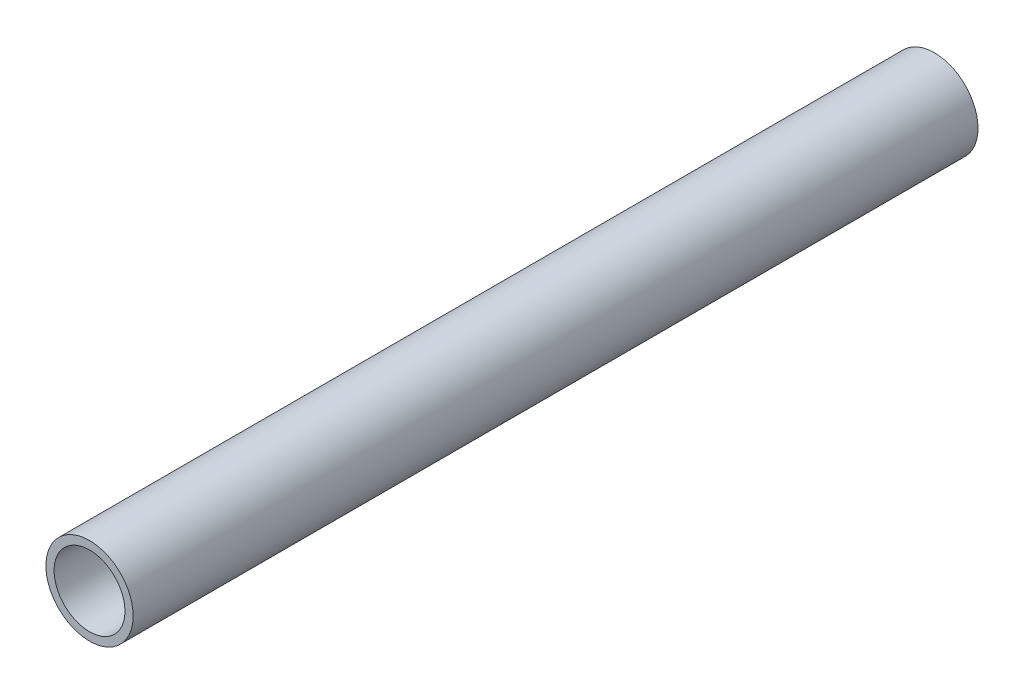
ISO-10303-21;
HEADER;
FILE_DESCRIPTION(('STEP AP214'),'2;1');
FILE_NAME('part.step','',(''),(''),'','','');
FILE_SCHEMA(('AUTOMOTIVE_DESIGN { 1 0 10303 214 1 1 1 1 }'));
ENDSEC;
DATA;
#1=APPLICATION_CONTEXT('core data for automotive mechanical design processes');
#2=APPLICATION_PROTOCOL_DEFINITION('international standard','automotive_design',2000,#1);
#3=PRODUCT_CONTEXT('',#1,'mechanical');
#4=PRODUCT('Part','Part','',(#3));
#5=PRODUCT_RELATED_PRODUCT_CATEGORY('part','',(#4));
#6=PRODUCT_DEFINITION_FORMATION('','',#4);
#7=PRODUCT_DEFINITION_CONTEXT('part definition',#1,'design');
#8=PRODUCT_DEFINITION('design','',#6,#7);
#9=PRODUCT_DEFINITION_SHAPE('','',#8);
#10=(LENGTH_UNIT() NAMED_UNIT(*) SI_UNIT(.MILLI.,.METRE.));
#11=(NAMED_UNIT(*) PLANE_ANGLE_UNIT() SI_UNIT($,.RADIAN.));
#12=(NAMED_UNIT(*) SI_UNIT($,.STERADIAN.) SOLID_ANGLE_UNIT());
#13=UNCERTAINTY_MEASURE_WITH_UNIT(LENGTH_MEASURE(1.E-05),#10,'distance_accuracy_value','');
#14=(GEOMETRIC_REPRESENTATION_CONTEXT(3) GLOBAL_UNCERTAINTY_ASSIGNED_CONTEXT((#13)) GLOBAL_UNIT_ASSIGNED_CONTEXT((#10,
#11,#12)) REPRESENTATION_CONTEXT('',''));
#15=CARTESIAN_POINT('',(0.,0.,0.));
#16=DIRECTION('',(0.,0.,1.));
#17=DIRECTION('',(1.,0.,0.));
#18=AXIS2_PLACEMENT_3D('',#15,#16,#17);
#19=CARTESIAN_POINT('',(0.,0.,155.));
#20=DIRECTION('',(0.,0.,1.));
#21=DIRECTION('',(1.,0.,0.));
#22=AXIS2_PLACEMENT_3D('',#19,#20,#21);
#23=PLANE('',#22);
#24=CARTESIAN_POINT('',(0.,0.,155.));
#25=DIRECTION('',(0.,0.,1.));
#26=DIRECTION('',(1.,0.,0.));
#27=AXIS2_PLACEMENT_3D('',#24,#25,#26);
#28=CIRCLE('',#27,8.);
#29=CARTESIAN_POINT('',(8.,0.,155.));
#30=VERTEX_POINT('',#29);
#31=EDGE_CURVE('E10',#30,#30,#28,.T.);
#32=ORIENTED_EDGE('',*,*,#31,.T.);
#33=EDGE_LOOP('',(#32));
#34=FACE_BOUND('',#33,.T.);
#35=CARTESIAN_POINT('',(0.,0.,155.));
#36=DIRECTION('',(0.,0.,1.));
#37=DIRECTION('',(1.,0.,0.));
#38=AXIS2_PLACEMENT_3D('',#35,#36,#37);
#39=CIRCLE('',#38,6.5);
#40=CARTESIAN_POINT('',(6.5,0.,155.));
#41=VERTEX_POINT('',#40);
#42=EDGE_CURVE('E45',#41,#41,#39,.T.);
#43=ORIENTED_EDGE('',*,*,#42,.F.);
#44=EDGE_LOOP('',(#43));
#45=FACE_BOUND('',#44,.T.);
#46=ADVANCED_FACE('F34',(#34,#45),#23,.T.);
#47=CARTESIAN_POINT('',(0.,0.,0.));
#48=DIRECTION('',(0.,0.,1.));
#49=DIRECTION('',(1.,0.,0.));
#50=AXIS2_PLACEMENT_3D('',#47,#48,#49);
#51=PLANE('',#50);
#52=CARTESIAN_POINT('',(0.,0.,0.));
#53=DIRECTION('',(0.,0.,1.));
#54=DIRECTION('',(1.,0.,0.));
#55=AXIS2_PLACEMENT_3D('',#52,#53,#54);
#56=CIRCLE('',#55,8.);
#57=CARTESIAN_POINT('',(8.,0.,0.));
#58=VERTEX_POINT('',#57);
#59=EDGE_CURVE('E38',#58,#58,#56,.T.);
#60=ORIENTED_EDGE('',*,*,#59,.F.);
#61=EDGE_LOOP('',(#60));
#62=FACE_BOUND('',#61,.T.);
#63=CARTESIAN_POINT('',(0.,0.,0.));
#64=DIRECTION('',(0.,0.,1.));
#65=DIRECTION('',(1.,0.,0.));
#66=AXIS2_PLACEMENT_3D('',#63,#64,#65);
#67=CIRCLE('',#66,6.5);
#68=CARTESIAN_POINT('',(6.5,0.,0.));
#69=VERTEX_POINT('',#68);
#70=EDGE_CURVE('E47',#69,#69,#67,.T.);
#71=ORIENTED_EDGE('',*,*,#70,.T.);
#72=EDGE_LOOP('',(#71));
#73=FACE_BOUND('',#72,.T.);
#74=ADVANCED_FACE('F57',(#62,#73),#51,.F.);
#75=CARTESIAN_POINT('',(0.,0.,155.));
#76=DIRECTION('',(0.,0.,-1.));
#77=DIRECTION('',(-1.,0.,0.));
#78=AXIS2_PLACEMENT_3D('',#75,#76,#77);
#79=CYLINDRICAL_SURFACE('',#78,8.);
#80=ORIENTED_EDGE('',*,*,#31,.F.);
#81=EDGE_LOOP('',(#80));
#82=FACE_BOUND('',#81,.T.);
#83=ORIENTED_EDGE('',*,*,#59,.T.);
#84=EDGE_LOOP('',(#83));
#85=FACE_BOUND('',#84,.T.);
#86=ADVANCED_FACE('F36',(#82,#85),#79,.T.);
#87=CARTESIAN_POINT('',(0.,0.,155.));
#88=DIRECTION('',(0.,0.,-1.));
#89=DIRECTION('',(-1.,0.,0.));
#90=AXIS2_PLACEMENT_3D('',#87,#88,#89);
#91=CYLINDRICAL_SURFACE('',#90,6.5);
#92=ORIENTED_EDGE('',*,*,#42,.T.);
#93=EDGE_LOOP('',(#92));
#94=FACE_BOUND('',#93,.T.);
#95=ORIENTED_EDGE('',*,*,#70,.F.);
#96=EDGE_LOOP('',(#95));
#97=FACE_BOUND('',#96,.T.);
#98=ADVANCED_FACE('F53',(#94,#97),#91,.F.);
#99=CLOSED_SHELL('',(#46,#74,#86,#98));
#100=MANIFOLD_SOLID_BREP('B2',#99);
#101=ADVANCED_BREP_SHAPE_REPRESENTATION('',(#18,#100),#14);
#102=SHAPE_DEFINITION_REPRESENTATION(#9,#101);
ENDSEC;
END-ISO-10303-21;
